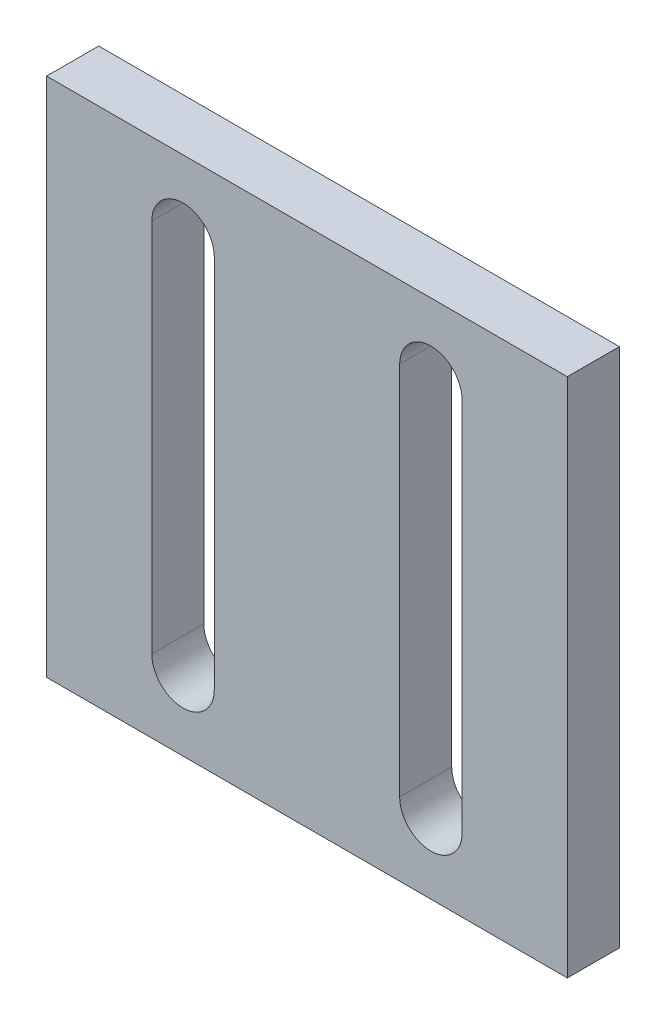
ISO-10303-21;
HEADER;
FILE_DESCRIPTION(('STEP AP214'),'2;1');
FILE_NAME('part.step','',(''),(''),'','','');
FILE_SCHEMA(('AUTOMOTIVE_DESIGN { 1 0 10303 214 1 1 1 1 }'));
ENDSEC;
DATA;
#1=APPLICATION_CONTEXT('core data for automotive mechanical design processes');
#2=APPLICATION_PROTOCOL_DEFINITION('international standard','automotive_design',2000,#1);
#3=PRODUCT_CONTEXT('',#1,'mechanical');
#4=PRODUCT('Part','Part','',(#3));
#5=PRODUCT_RELATED_PRODUCT_CATEGORY('part','',(#4));
#6=PRODUCT_DEFINITION_FORMATION('','',#4);
#7=PRODUCT_DEFINITION_CONTEXT('part definition',#1,'design');
#8=PRODUCT_DEFINITION('design','',#6,#7);
#9=PRODUCT_DEFINITION_SHAPE('','',#8);
#10=(LENGTH_UNIT() NAMED_UNIT(*) SI_UNIT(.MILLI.,.METRE.));
#11=(NAMED_UNIT(*) PLANE_ANGLE_UNIT() SI_UNIT($,.RADIAN.));
#12=(NAMED_UNIT(*) SI_UNIT($,.STERADIAN.) SOLID_ANGLE_UNIT());
#13=UNCERTAINTY_MEASURE_WITH_UNIT(LENGTH_MEASURE(1.E-05),#10,'distance_accuracy_value','');
#14=(GEOMETRIC_REPRESENTATION_CONTEXT(3) GLOBAL_UNCERTAINTY_ASSIGNED_CONTEXT((#13)) GLOBAL_UNIT_ASSIGNED_CONTEXT((#10,
#11,#12)) REPRESENTATION_CONTEXT('',''));
#15=CARTESIAN_POINT('',(0.,0.,0.));
#16=DIRECTION('',(0.,0.,1.));
#17=DIRECTION('',(1.,0.,0.));
#18=AXIS2_PLACEMENT_3D('',#15,#16,#17);
#19=CARTESIAN_POINT('',(0.,0.,5.));
#20=DIRECTION('',(1.,0.,0.));
#21=DIRECTION('',(0.,0.,-1.));
#22=AXIS2_PLACEMENT_3D('',#19,#20,#21);
#23=PLANE('',#22);
#24=DIRECTION('',(0.,-1.,0.));
#25=VECTOR('',#24,1.);
#26=CARTESIAN_POINT('',(0.,0.,0.));
#27=LINE('',#26,#25);
#28=CARTESIAN_POINT('',(0.,50.,0.));
#29=VERTEX_POINT('',#28);
#30=CARTESIAN_POINT('',(0.,0.,0.));
#31=VERTEX_POINT('',#30);
#32=EDGE_CURVE('E161',#29,#31,#27,.T.);
#33=ORIENTED_EDGE('',*,*,#32,.T.);
#34=DIRECTION('',(0.,0.,-1.));
#35=VECTOR('',#34,1.);
#36=CARTESIAN_POINT('',(0.,0.,5.));
#37=LINE('',#36,#35);
#38=CARTESIAN_POINT('',(0.,0.,5.));
#39=VERTEX_POINT('',#38);
#40=EDGE_CURVE('E11',#39,#31,#37,.T.);
#41=ORIENTED_EDGE('',*,*,#40,.F.);
#42=DIRECTION('',(0.,-1.,0.));
#43=VECTOR('',#42,1.);
#44=CARTESIAN_POINT('',(0.,0.,5.));
#45=LINE('',#44,#43);
#46=CARTESIAN_POINT('',(0.,50.,5.));
#47=VERTEX_POINT('',#46);
#48=EDGE_CURVE('E194',#47,#39,#45,.T.);
#49=ORIENTED_EDGE('',*,*,#48,.F.);
#50=DIRECTION('',(0.,0.,-1.));
#51=VECTOR('',#50,1.);
#52=CARTESIAN_POINT('',(0.,50.,5.));
#53=LINE('',#52,#51);
#54=EDGE_CURVE('E204',#47,#29,#53,.T.);
#55=ORIENTED_EDGE('',*,*,#54,.T.);
#56=EDGE_LOOP('',(#33,#41,#49,#55));
#57=FACE_BOUND('',#56,.T.);
#58=ADVANCED_FACE('F36',(#57),#23,.F.);
#59=CARTESIAN_POINT('',(0.,0.,5.));
#60=DIRECTION('',(0.,1.,0.));
#61=DIRECTION('',(0.,0.,1.));
#62=AXIS2_PLACEMENT_3D('',#59,#60,#61);
#63=PLANE('',#62);
#64=DIRECTION('',(1.,0.,0.));
#65=VECTOR('',#64,1.);
#66=CARTESIAN_POINT('',(0.,0.,0.));
#67=LINE('',#66,#65);
#68=CARTESIAN_POINT('',(50.,0.,0.));
#69=VERTEX_POINT('',#68);
#70=EDGE_CURVE('E207',#31,#69,#67,.T.);
#71=ORIENTED_EDGE('',*,*,#70,.T.);
#72=DIRECTION('',(0.,0.,-1.));
#73=VECTOR('',#72,1.);
#74=CARTESIAN_POINT('',(50.,0.,5.));
#75=LINE('',#74,#73);
#76=CARTESIAN_POINT('',(50.,0.,5.));
#77=VERTEX_POINT('',#76);
#78=EDGE_CURVE('E43',#77,#69,#75,.T.);
#79=ORIENTED_EDGE('',*,*,#78,.F.);
#80=DIRECTION('',(1.,0.,0.));
#81=VECTOR('',#80,1.);
#82=CARTESIAN_POINT('',(0.,0.,5.));
#83=LINE('',#82,#81);
#84=EDGE_CURVE('E197',#39,#77,#83,.T.);
#85=ORIENTED_EDGE('',*,*,#84,.F.);
#86=ORIENTED_EDGE('',*,*,#40,.T.);
#87=EDGE_LOOP('',(#71,#79,#85,#86));
#88=FACE_BOUND('',#87,.T.);
#89=ADVANCED_FACE('F236',(#88),#63,.F.);
#90=CARTESIAN_POINT('',(50.,50.,5.));
#91=DIRECTION('',(-1.,0.,0.));
#92=DIRECTION('',(0.,0.,1.));
#93=AXIS2_PLACEMENT_3D('',#90,#91,#92);
#94=PLANE('',#93);
#95=DIRECTION('',(0.,1.,0.));
#96=VECTOR('',#95,1.);
#97=CARTESIAN_POINT('',(50.,50.,0.));
#98=LINE('',#97,#96);
#99=CARTESIAN_POINT('',(50.,50.,0.));
#100=VERTEX_POINT('',#99);
#101=EDGE_CURVE('E209',#69,#100,#98,.T.);
#102=ORIENTED_EDGE('',*,*,#101,.T.);
#103=DIRECTION('',(0.,0.,-1.));
#104=VECTOR('',#103,1.);
#105=CARTESIAN_POINT('',(50.,50.,5.));
#106=LINE('',#105,#104);
#107=CARTESIAN_POINT('',(50.,50.,5.));
#108=VERTEX_POINT('',#107);
#109=EDGE_CURVE('E214',#108,#100,#106,.T.);
#110=ORIENTED_EDGE('',*,*,#109,.F.);
#111=DIRECTION('',(0.,1.,0.));
#112=VECTOR('',#111,1.);
#113=CARTESIAN_POINT('',(50.,50.,5.));
#114=LINE('',#113,#112);
#115=EDGE_CURVE('E200',#77,#108,#114,.T.);
#116=ORIENTED_EDGE('',*,*,#115,.F.);
#117=ORIENTED_EDGE('',*,*,#78,.T.);
#118=EDGE_LOOP('',(#102,#110,#116,#117));
#119=FACE_BOUND('',#118,.T.);
#120=ADVANCED_FACE('F221',(#119),#94,.F.);
#121=CARTESIAN_POINT('',(0.,50.,5.));
#122=DIRECTION('',(0.,-1.,0.));
#123=DIRECTION('',(0.,0.,-1.));
#124=AXIS2_PLACEMENT_3D('',#121,#122,#123);
#125=PLANE('',#124);
#126=DIRECTION('',(-1.,0.,0.));
#127=VECTOR('',#126,1.);
#128=CARTESIAN_POINT('',(0.,50.,0.));
#129=LINE('',#128,#127);
#130=EDGE_CURVE('E198',#100,#29,#129,.T.);
#131=ORIENTED_EDGE('',*,*,#130,.T.);
#132=ORIENTED_EDGE('',*,*,#54,.F.);
#133=DIRECTION('',(-1.,0.,0.));
#134=VECTOR('',#133,1.);
#135=CARTESIAN_POINT('',(0.,50.,5.));
#136=LINE('',#135,#134);
#137=EDGE_CURVE('E202',#108,#47,#136,.T.);
#138=ORIENTED_EDGE('',*,*,#137,.F.);
#139=ORIENTED_EDGE('',*,*,#109,.T.);
#140=EDGE_LOOP('',(#131,#132,#138,#139));
#141=FACE_BOUND('',#140,.T.);
#142=ADVANCED_FACE('F229',(#141),#125,.F.);
#143=CARTESIAN_POINT('',(0.,0.,5.));
#144=DIRECTION('',(0.,0.,-1.));
#145=DIRECTION('',(-1.,0.,0.));
#146=AXIS2_PLACEMENT_3D('',#143,#144,#145);
#147=PLANE('',#146);
#148=DIRECTION('',(0.,1.,0.));
#149=VECTOR('',#148,1.);
#150=CARTESIAN_POINT('',(16.1,43.,5.));
#151=LINE('',#150,#149);
#152=CARTESIAN_POINT('',(16.1,7.00000000000001,5.));
#153=VERTEX_POINT('',#152);
#154=CARTESIAN_POINT('',(16.1,43.,5.));
#155=VERTEX_POINT('',#154);
#156=EDGE_CURVE('E154',#153,#155,#151,.T.);
#157=ORIENTED_EDGE('',*,*,#156,.F.);
#158=CARTESIAN_POINT('',(13.1,7.00000000000001,5.));
#159=DIRECTION('',(0.,0.,1.));
#160=DIRECTION('',(-1.,0.,0.));
#161=AXIS2_PLACEMENT_3D('',#158,#159,#160);
#162=CIRCLE('',#161,3.);
#163=CARTESIAN_POINT('',(10.1,7.00000000000001,5.));
#164=VERTEX_POINT('',#163);
#165=EDGE_CURVE('E50',#164,#153,#162,.T.);
#166=ORIENTED_EDGE('',*,*,#165,.F.);
#167=DIRECTION('',(0.,-1.,0.));
#168=VECTOR('',#167,1.);
#169=CARTESIAN_POINT('',(10.1,43.,5.));
#170=LINE('',#169,#168);
#171=CARTESIAN_POINT('',(10.1,43.,5.));
#172=VERTEX_POINT('',#171);
#173=EDGE_CURVE('E145',#172,#164,#170,.T.);
#174=ORIENTED_EDGE('',*,*,#173,.F.);
#175=CARTESIAN_POINT('',(13.1,43.,5.));
#176=DIRECTION('',(0.,0.,1.));
#177=DIRECTION('',(1.,0.,0.));
#178=AXIS2_PLACEMENT_3D('',#175,#176,#177);
#179=CIRCLE('',#178,3.);
#180=EDGE_CURVE('E148',#155,#172,#179,.T.);
#181=ORIENTED_EDGE('',*,*,#180,.F.);
#182=EDGE_LOOP('',(#157,#166,#174,#181));
#183=FACE_BOUND('',#182,.T.);
#184=DIRECTION('',(0.,-1.,0.));
#185=VECTOR('',#184,1.);
#186=CARTESIAN_POINT('',(33.9,43.,5.));
#187=LINE('',#186,#185);
#188=CARTESIAN_POINT('',(33.9,43.,5.));
#189=VERTEX_POINT('',#188);
#190=CARTESIAN_POINT('',(33.9,7.,5.));
#191=VERTEX_POINT('',#190);
#192=EDGE_CURVE('E180',#189,#191,#187,.T.);
#193=ORIENTED_EDGE('',*,*,#192,.F.);
#194=CARTESIAN_POINT('',(36.9,43.,5.));
#195=DIRECTION('',(0.,0.,1.));
#196=DIRECTION('',(1.,0.,0.));
#197=AXIS2_PLACEMENT_3D('',#194,#195,#196);
#198=CIRCLE('',#197,3.);
#199=CARTESIAN_POINT('',(39.9,43.,5.));
#200=VERTEX_POINT('',#199);
#201=EDGE_CURVE('E58',#200,#189,#198,.T.);
#202=ORIENTED_EDGE('',*,*,#201,.F.);
#203=DIRECTION('',(0.,1.,0.));
#204=VECTOR('',#203,1.);
#205=CARTESIAN_POINT('',(39.9,43.,5.));
#206=LINE('',#205,#204);
#207=CARTESIAN_POINT('',(39.9,7.,5.));
#208=VERTEX_POINT('',#207);
#209=EDGE_CURVE('E169',#208,#200,#206,.T.);
#210=ORIENTED_EDGE('',*,*,#209,.F.);
#211=CARTESIAN_POINT('',(36.9,7.,5.));
#212=DIRECTION('',(0.,0.,1.));
#213=DIRECTION('',(-1.,0.,0.));
#214=AXIS2_PLACEMENT_3D('',#211,#212,#213);
#215=CIRCLE('',#214,3.);
#216=EDGE_CURVE('E183',#191,#208,#215,.T.);
#217=ORIENTED_EDGE('',*,*,#216,.F.);
#218=EDGE_LOOP('',(#193,#202,#210,#217));
#219=FACE_BOUND('',#218,.T.);
#220=ORIENTED_EDGE('',*,*,#48,.T.);
#221=ORIENTED_EDGE('',*,*,#84,.T.);
#222=ORIENTED_EDGE('',*,*,#115,.T.);
#223=ORIENTED_EDGE('',*,*,#137,.T.);
#224=EDGE_LOOP('',(#220,#221,#222,#223));
#225=FACE_BOUND('',#224,.T.);
#226=ADVANCED_FACE('F235',(#183,#219,#225),#147,.F.);
#227=CARTESIAN_POINT('',(0.,0.,0.));
#228=DIRECTION('',(0.,0.,-1.));
#229=DIRECTION('',(-1.,0.,0.));
#230=AXIS2_PLACEMENT_3D('',#227,#228,#229);
#231=PLANE('',#230);
#232=CARTESIAN_POINT('',(13.1,7.00000000000001,0.));
#233=DIRECTION('',(0.,0.,1.));
#234=DIRECTION('',(-1.,0.,0.));
#235=AXIS2_PLACEMENT_3D('',#232,#233,#234);
#236=CIRCLE('',#235,3.);
#237=CARTESIAN_POINT('',(10.1,7.00000000000001,0.));
#238=VERTEX_POINT('',#237);
#239=CARTESIAN_POINT('',(16.1,7.00000000000001,0.));
#240=VERTEX_POINT('',#239);
#241=EDGE_CURVE('E126',#238,#240,#236,.T.);
#242=ORIENTED_EDGE('',*,*,#241,.T.);
#243=DIRECTION('',(0.,1.,0.));
#244=VECTOR('',#243,1.);
#245=CARTESIAN_POINT('',(16.1,43.,0.));
#246=LINE('',#245,#244);
#247=CARTESIAN_POINT('',(16.1,43.,0.));
#248=VERTEX_POINT('',#247);
#249=EDGE_CURVE('E136',#240,#248,#246,.T.);
#250=ORIENTED_EDGE('',*,*,#249,.T.);
#251=CARTESIAN_POINT('',(13.1,43.,0.));
#252=DIRECTION('',(0.,0.,1.));
#253=DIRECTION('',(1.,0.,0.));
#254=AXIS2_PLACEMENT_3D('',#251,#252,#253);
#255=CIRCLE('',#254,3.);
#256=CARTESIAN_POINT('',(10.1,43.,0.));
#257=VERTEX_POINT('',#256);
#258=EDGE_CURVE('E140',#248,#257,#255,.T.);
#259=ORIENTED_EDGE('',*,*,#258,.T.);
#260=DIRECTION('',(0.,-1.,0.));
#261=VECTOR('',#260,1.);
#262=CARTESIAN_POINT('',(10.1,43.,0.));
#263=LINE('',#262,#261);
#264=EDGE_CURVE('E132',#257,#238,#263,.T.);
#265=ORIENTED_EDGE('',*,*,#264,.T.);
#266=EDGE_LOOP('',(#242,#250,#259,#265));
#267=FACE_BOUND('',#266,.T.);
#268=CARTESIAN_POINT('',(36.9,43.,0.));
#269=DIRECTION('',(0.,0.,1.));
#270=DIRECTION('',(1.,0.,0.));
#271=AXIS2_PLACEMENT_3D('',#268,#269,#270);
#272=CIRCLE('',#271,3.);
#273=CARTESIAN_POINT('',(39.9,43.,0.));
#274=VERTEX_POINT('',#273);
#275=CARTESIAN_POINT('',(33.9,43.,0.));
#276=VERTEX_POINT('',#275);
#277=EDGE_CURVE('E165',#274,#276,#272,.T.);
#278=ORIENTED_EDGE('',*,*,#277,.T.);
#279=DIRECTION('',(0.,-1.,0.));
#280=VECTOR('',#279,1.);
#281=CARTESIAN_POINT('',(33.9,43.,0.));
#282=LINE('',#281,#280);
#283=CARTESIAN_POINT('',(33.9,7.,0.));
#284=VERTEX_POINT('',#283);
#285=EDGE_CURVE('E168',#276,#284,#282,.T.);
#286=ORIENTED_EDGE('',*,*,#285,.T.);
#287=CARTESIAN_POINT('',(36.9,7.,0.));
#288=DIRECTION('',(0.,0.,1.));
#289=DIRECTION('',(-1.,0.,0.));
#290=AXIS2_PLACEMENT_3D('',#287,#288,#289);
#291=CIRCLE('',#290,3.);
#292=CARTESIAN_POINT('',(39.9,7.,0.));
#293=VERTEX_POINT('',#292);
#294=EDGE_CURVE('E172',#284,#293,#291,.T.);
#295=ORIENTED_EDGE('',*,*,#294,.T.);
#296=DIRECTION('',(0.,1.,0.));
#297=VECTOR('',#296,1.);
#298=CARTESIAN_POINT('',(39.9,43.,0.));
#299=LINE('',#298,#297);
#300=EDGE_CURVE('E175',#293,#274,#299,.T.);
#301=ORIENTED_EDGE('',*,*,#300,.T.);
#302=EDGE_LOOP('',(#278,#286,#295,#301));
#303=FACE_BOUND('',#302,.T.);
#304=ORIENTED_EDGE('',*,*,#32,.F.);
#305=ORIENTED_EDGE('',*,*,#130,.F.);
#306=ORIENTED_EDGE('',*,*,#101,.F.);
#307=ORIENTED_EDGE('',*,*,#70,.F.);
#308=EDGE_LOOP('',(#304,#305,#306,#307));
#309=FACE_BOUND('',#308,.T.);
#310=ADVANCED_FACE('F142',(#267,#303,#309),#231,.T.);
#311=CARTESIAN_POINT('',(36.9,43.,0.));
#312=DIRECTION('',(0.,0.,1.));
#313=DIRECTION('',(1.,0.,0.));
#314=AXIS2_PLACEMENT_3D('',#311,#312,#313);
#315=CYLINDRICAL_SURFACE('',#314,3.);
#316=ORIENTED_EDGE('',*,*,#201,.T.);
#317=DIRECTION('',(0.,0.,1.));
#318=VECTOR('',#317,1.);
#319=CARTESIAN_POINT('',(33.9,43.,0.));
#320=LINE('',#319,#318);
#321=EDGE_CURVE('E178',#276,#189,#320,.T.);
#322=ORIENTED_EDGE('',*,*,#321,.F.);
#323=ORIENTED_EDGE('',*,*,#277,.F.);
#324=DIRECTION('',(0.,0.,1.));
#325=VECTOR('',#324,1.);
#326=CARTESIAN_POINT('',(39.9,43.,0.));
#327=LINE('',#326,#325);
#328=EDGE_CURVE('E155',#274,#200,#327,.T.);
#329=ORIENTED_EDGE('',*,*,#328,.T.);
#330=EDGE_LOOP('',(#316,#322,#323,#329));
#331=FACE_BOUND('',#330,.T.);
#332=ADVANCED_FACE('F248',(#331),#315,.F.);
#333=CARTESIAN_POINT('',(39.9,43.,0.));
#334=DIRECTION('',(1.,0.,0.));
#335=DIRECTION('',(0.,0.,-1.));
#336=AXIS2_PLACEMENT_3D('',#333,#334,#335);
#337=PLANE('',#336);
#338=ORIENTED_EDGE('',*,*,#209,.T.);
#339=ORIENTED_EDGE('',*,*,#328,.F.);
#340=ORIENTED_EDGE('',*,*,#300,.F.);
#341=DIRECTION('',(0.,0.,1.));
#342=VECTOR('',#341,1.);
#343=CARTESIAN_POINT('',(39.9,7.,0.));
#344=LINE('',#343,#342);
#345=EDGE_CURVE('E189',#293,#208,#344,.T.);
#346=ORIENTED_EDGE('',*,*,#345,.T.);
#347=EDGE_LOOP('',(#338,#339,#340,#346));
#348=FACE_BOUND('',#347,.T.);
#349=ADVANCED_FACE('F254',(#348),#337,.F.);
#350=CARTESIAN_POINT('',(36.9,7.,0.));
#351=DIRECTION('',(0.,0.,1.));
#352=DIRECTION('',(1.,0.,0.));
#353=AXIS2_PLACEMENT_3D('',#350,#351,#352);
#354=CYLINDRICAL_SURFACE('',#353,3.);
#355=ORIENTED_EDGE('',*,*,#216,.T.);
#356=ORIENTED_EDGE('',*,*,#345,.F.);
#357=ORIENTED_EDGE('',*,*,#294,.F.);
#358=DIRECTION('',(0.,0.,1.));
#359=VECTOR('',#358,1.);
#360=CARTESIAN_POINT('',(33.9,7.,0.));
#361=LINE('',#360,#359);
#362=EDGE_CURVE('E191',#284,#191,#361,.T.);
#363=ORIENTED_EDGE('',*,*,#362,.T.);
#364=EDGE_LOOP('',(#355,#356,#357,#363));
#365=FACE_BOUND('',#364,.T.);
#366=ADVANCED_FACE('F258',(#365),#354,.F.);
#367=CARTESIAN_POINT('',(33.9,43.,0.));
#368=DIRECTION('',(-1.,0.,0.));
#369=DIRECTION('',(0.,0.,1.));
#370=AXIS2_PLACEMENT_3D('',#367,#368,#369);
#371=PLANE('',#370);
#372=ORIENTED_EDGE('',*,*,#192,.T.);
#373=ORIENTED_EDGE('',*,*,#362,.F.);
#374=ORIENTED_EDGE('',*,*,#285,.F.);
#375=ORIENTED_EDGE('',*,*,#321,.T.);
#376=EDGE_LOOP('',(#372,#373,#374,#375));
#377=FACE_BOUND('',#376,.T.);
#378=ADVANCED_FACE('F255',(#377),#371,.F.);
#379=CARTESIAN_POINT('',(13.1,7.00000000000001,0.));
#380=DIRECTION('',(0.,0.,1.));
#381=DIRECTION('',(1.,0.,0.));
#382=AXIS2_PLACEMENT_3D('',#379,#380,#381);
#383=CYLINDRICAL_SURFACE('',#382,3.);
#384=ORIENTED_EDGE('',*,*,#165,.T.);
#385=DIRECTION('',(0.,0.,1.));
#386=VECTOR('',#385,1.);
#387=CARTESIAN_POINT('',(16.1,7.00000000000001,0.));
#388=LINE('',#387,#386);
#389=EDGE_CURVE('E122',#240,#153,#388,.T.);
#390=ORIENTED_EDGE('',*,*,#389,.F.);
#391=ORIENTED_EDGE('',*,*,#241,.F.);
#392=DIRECTION('',(0.,0.,1.));
#393=VECTOR('',#392,1.);
#394=CARTESIAN_POINT('',(10.1,7.00000000000001,0.));
#395=LINE('',#394,#393);
#396=EDGE_CURVE('E159',#238,#164,#395,.T.);
#397=ORIENTED_EDGE('',*,*,#396,.T.);
#398=EDGE_LOOP('',(#384,#390,#391,#397));
#399=FACE_BOUND('',#398,.T.);
#400=ADVANCED_FACE('F124',(#399),#383,.F.);
#401=CARTESIAN_POINT('',(10.1,43.,0.));
#402=DIRECTION('',(-1.,0.,0.));
#403=DIRECTION('',(0.,-1.,0.));
#404=AXIS2_PLACEMENT_3D('',#401,#402,#403);
#405=PLANE('',#404);
#406=ORIENTED_EDGE('',*,*,#173,.T.);
#407=ORIENTED_EDGE('',*,*,#396,.F.);
#408=ORIENTED_EDGE('',*,*,#264,.F.);
#409=DIRECTION('',(0.,0.,1.));
#410=VECTOR('',#409,1.);
#411=CARTESIAN_POINT('',(10.1,43.,0.));
#412=LINE('',#411,#410);
#413=EDGE_CURVE('E162',#257,#172,#412,.T.);
#414=ORIENTED_EDGE('',*,*,#413,.T.);
#415=EDGE_LOOP('',(#406,#407,#408,#414));
#416=FACE_BOUND('',#415,.T.);
#417=ADVANCED_FACE('F268',(#416),#405,.F.);
#418=CARTESIAN_POINT('',(13.1,43.,0.));
#419=DIRECTION('',(0.,0.,1.));
#420=DIRECTION('',(1.,0.,0.));
#421=AXIS2_PLACEMENT_3D('',#418,#419,#420);
#422=CYLINDRICAL_SURFACE('',#421,3.);
#423=ORIENTED_EDGE('',*,*,#180,.T.);
#424=ORIENTED_EDGE('',*,*,#413,.F.);
#425=ORIENTED_EDGE('',*,*,#258,.F.);
#426=DIRECTION('',(0.,0.,1.));
#427=VECTOR('',#426,1.);
#428=CARTESIAN_POINT('',(16.1,43.,0.));
#429=LINE('',#428,#427);
#430=EDGE_CURVE('E131',#248,#155,#429,.T.);
#431=ORIENTED_EDGE('',*,*,#430,.T.);
#432=EDGE_LOOP('',(#423,#424,#425,#431));
#433=FACE_BOUND('',#432,.T.);
#434=ADVANCED_FACE('F271',(#433),#422,.F.);
#435=CARTESIAN_POINT('',(16.1,43.,0.));
#436=DIRECTION('',(1.,0.,0.));
#437=DIRECTION('',(0.,0.,-1.));
#438=AXIS2_PLACEMENT_3D('',#435,#436,#437);
#439=PLANE('',#438);
#440=ORIENTED_EDGE('',*,*,#156,.T.);
#441=ORIENTED_EDGE('',*,*,#430,.F.);
#442=ORIENTED_EDGE('',*,*,#249,.F.);
#443=ORIENTED_EDGE('',*,*,#389,.T.);
#444=EDGE_LOOP('',(#440,#441,#442,#443));
#445=FACE_BOUND('',#444,.T.);
#446=ADVANCED_FACE('F137',(#445),#439,.F.);
#447=CLOSED_SHELL('',(#58,#89,#120,#142,#226,#310,#332,#349,#366,#378,#400,#417,#434,#446));
#448=MANIFOLD_SOLID_BREP('B2',#447);
#449=ADVANCED_BREP_SHAPE_REPRESENTATION('',(#18,#448),#14);
#450=SHAPE_DEFINITION_REPRESENTATION(#9,#449);
ENDSEC;
END-ISO-10303-21;
